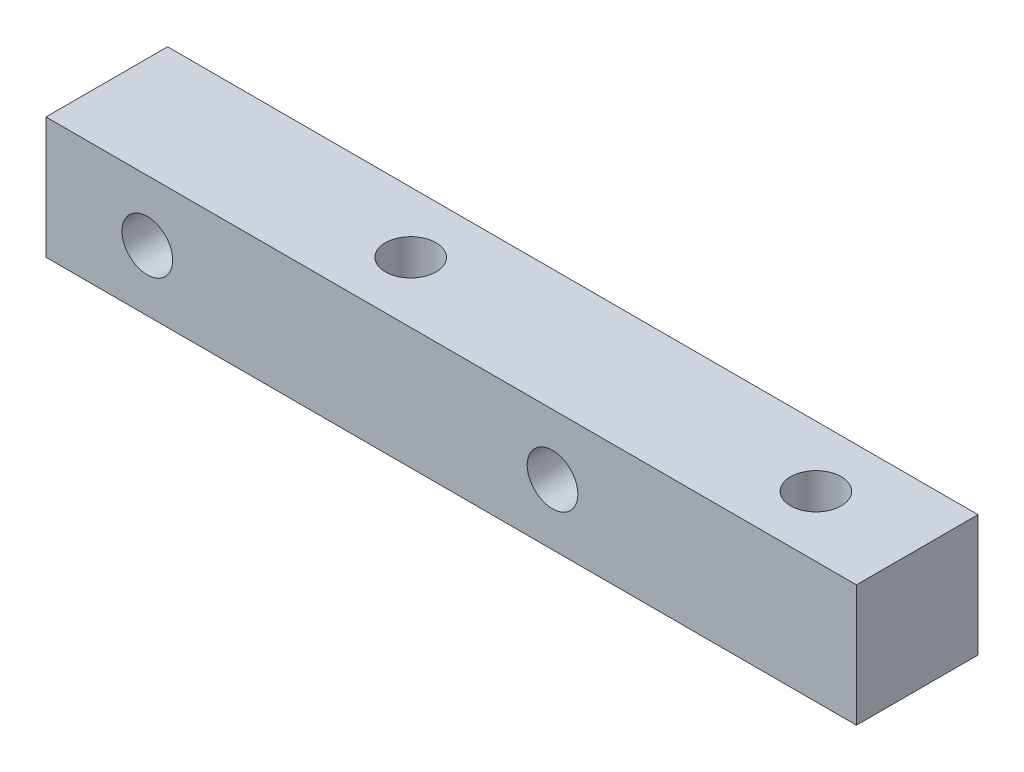
ISO-10303-21;
HEADER;
FILE_DESCRIPTION(('STEP AP214'),'2;1');
FILE_NAME('part.step','',(''),(''),'','','');
FILE_SCHEMA(('AUTOMOTIVE_DESIGN { 1 0 10303 214 1 1 1 1 }'));
ENDSEC;
DATA;
#1=APPLICATION_CONTEXT('core data for automotive mechanical design processes');
#2=APPLICATION_PROTOCOL_DEFINITION('international standard','automotive_design',2000,#1);
#3=PRODUCT_CONTEXT('',#1,'mechanical');
#4=PRODUCT('Part','Part','',(#3));
#5=PRODUCT_RELATED_PRODUCT_CATEGORY('part','',(#4));
#6=PRODUCT_DEFINITION_FORMATION('','',#4);
#7=PRODUCT_DEFINITION_CONTEXT('part definition',#1,'design');
#8=PRODUCT_DEFINITION('design','',#6,#7);
#9=PRODUCT_DEFINITION_SHAPE('','',#8);
#10=(LENGTH_UNIT() NAMED_UNIT(*) SI_UNIT(.MILLI.,.METRE.));
#11=(NAMED_UNIT(*) PLANE_ANGLE_UNIT() SI_UNIT($,.RADIAN.));
#12=(NAMED_UNIT(*) SI_UNIT($,.STERADIAN.) SOLID_ANGLE_UNIT());
#13=UNCERTAINTY_MEASURE_WITH_UNIT(LENGTH_MEASURE(1.E-05),#10,'distance_accuracy_value','');
#14=(GEOMETRIC_REPRESENTATION_CONTEXT(3) GLOBAL_UNCERTAINTY_ASSIGNED_CONTEXT((#13)) GLOBAL_UNIT_ASSIGNED_CONTEXT((#10,
#11,#12)) REPRESENTATION_CONTEXT('',''));
#15=CARTESIAN_POINT('',(0.,0.,0.));
#16=DIRECTION('',(0.,0.,1.));
#17=DIRECTION('',(1.,0.,0.));
#18=AXIS2_PLACEMENT_3D('',#15,#16,#17);
#19=CARTESIAN_POINT('',(20.,3.,-3.));
#20=DIRECTION('',(-1.,0.,0.));
#21=DIRECTION('',(0.,0.,1.));
#22=AXIS2_PLACEMENT_3D('',#19,#20,#21);
#23=PLANE('',#22);
#24=DIRECTION('',(0.,0.,-1.));
#25=VECTOR('',#24,1.);
#26=CARTESIAN_POINT('',(20.,-3.,-3.));
#27=LINE('',#26,#25);
#28=CARTESIAN_POINT('',(20.,-3.,3.));
#29=VERTEX_POINT('',#28);
#30=CARTESIAN_POINT('',(20.,-3.,-3.));
#31=VERTEX_POINT('',#30);
#32=EDGE_CURVE('E104',#29,#31,#27,.T.);
#33=ORIENTED_EDGE('',*,*,#32,.T.);
#34=DIRECTION('',(0.,-1.,0.));
#35=VECTOR('',#34,1.);
#36=CARTESIAN_POINT('',(20.,3.,-3.));
#37=LINE('',#36,#35);
#38=CARTESIAN_POINT('',(20.,3.,-3.));
#39=VERTEX_POINT('',#38);
#40=EDGE_CURVE('E11',#39,#31,#37,.T.);
#41=ORIENTED_EDGE('',*,*,#40,.F.);
#42=DIRECTION('',(0.,0.,-1.));
#43=VECTOR('',#42,1.);
#44=CARTESIAN_POINT('',(20.,3.,-3.));
#45=LINE('',#44,#43);
#46=CARTESIAN_POINT('',(20.,3.,3.));
#47=VERTEX_POINT('',#46);
#48=EDGE_CURVE('E92',#47,#39,#45,.T.);
#49=ORIENTED_EDGE('',*,*,#48,.F.);
#50=DIRECTION('',(0.,-1.,0.));
#51=VECTOR('',#50,1.);
#52=CARTESIAN_POINT('',(20.,3.,3.));
#53=LINE('',#52,#51);
#54=EDGE_CURVE('E100',#47,#29,#53,.T.);
#55=ORIENTED_EDGE('',*,*,#54,.T.);
#56=EDGE_LOOP('',(#33,#41,#49,#55));
#57=FACE_BOUND('',#56,.T.);
#58=ADVANCED_FACE('F41',(#57),#23,.F.);
#59=CARTESIAN_POINT('',(-20.,3.,-3.));
#60=DIRECTION('',(0.,0.,1.));
#61=DIRECTION('',(1.,0.,0.));
#62=AXIS2_PLACEMENT_3D('',#59,#60,#61);
#63=PLANE('',#62);
#64=CARTESIAN_POINT('',(-15.,0.,-3.));
#65=DIRECTION('',(0.,0.,1.));
#66=DIRECTION('',(1.,0.,0.));
#67=AXIS2_PLACEMENT_3D('',#64,#65,#66);
#68=CIRCLE('',#67,1.25);
#69=CARTESIAN_POINT('',(-13.75,0.,-3.));
#70=VERTEX_POINT('',#69);
#71=EDGE_CURVE('E135',#70,#70,#68,.T.);
#72=ORIENTED_EDGE('',*,*,#71,.T.);
#73=EDGE_LOOP('',(#72));
#74=FACE_BOUND('',#73,.T.);
#75=CARTESIAN_POINT('',(5.,0.,-3.));
#76=DIRECTION('',(0.,0.,1.));
#77=DIRECTION('',(1.,0.,0.));
#78=AXIS2_PLACEMENT_3D('',#75,#76,#77);
#79=CIRCLE('',#78,1.25);
#80=CARTESIAN_POINT('',(6.25,0.,-3.));
#81=VERTEX_POINT('',#80);
#82=EDGE_CURVE('E129',#81,#81,#79,.T.);
#83=ORIENTED_EDGE('',*,*,#82,.T.);
#84=EDGE_LOOP('',(#83));
#85=FACE_BOUND('',#84,.T.);
#86=DIRECTION('',(-1.,0.,0.));
#87=VECTOR('',#86,1.);
#88=CARTESIAN_POINT('',(-20.,-3.,-3.));
#89=LINE('',#88,#87);
#90=CARTESIAN_POINT('',(-20.,-3.,-3.));
#91=VERTEX_POINT('',#90);
#92=EDGE_CURVE('E96',#31,#91,#89,.T.);
#93=ORIENTED_EDGE('',*,*,#92,.T.);
#94=DIRECTION('',(0.,-1.,0.));
#95=VECTOR('',#94,1.);
#96=CARTESIAN_POINT('',(-20.,3.,-3.));
#97=LINE('',#96,#95);
#98=CARTESIAN_POINT('',(-20.,3.,-3.));
#99=VERTEX_POINT('',#98);
#100=EDGE_CURVE('E49',#99,#91,#97,.T.);
#101=ORIENTED_EDGE('',*,*,#100,.F.);
#102=DIRECTION('',(-1.,0.,0.));
#103=VECTOR('',#102,1.);
#104=CARTESIAN_POINT('',(-20.,3.,-3.));
#105=LINE('',#104,#103);
#106=EDGE_CURVE('E87',#39,#99,#105,.T.);
#107=ORIENTED_EDGE('',*,*,#106,.F.);
#108=ORIENTED_EDGE('',*,*,#40,.T.);
#109=EDGE_LOOP('',(#93,#101,#107,#108));
#110=FACE_BOUND('',#109,.T.);
#111=ADVANCED_FACE('F95',(#74,#85,#110),#63,.F.);
#112=CARTESIAN_POINT('',(-20.,3.,-3.));
#113=DIRECTION('',(1.,0.,0.));
#114=DIRECTION('',(0.,0.,-1.));
#115=AXIS2_PLACEMENT_3D('',#112,#113,#114);
#116=PLANE('',#115);
#117=DIRECTION('',(0.,0.,1.));
#118=VECTOR('',#117,1.);
#119=CARTESIAN_POINT('',(-20.,-3.,-3.));
#120=LINE('',#119,#118);
#121=CARTESIAN_POINT('',(-20.,-3.,3.));
#122=VERTEX_POINT('',#121);
#123=EDGE_CURVE('E74',#91,#122,#120,.T.);
#124=ORIENTED_EDGE('',*,*,#123,.T.);
#125=DIRECTION('',(0.,-1.,0.));
#126=VECTOR('',#125,1.);
#127=CARTESIAN_POINT('',(-20.,3.,3.));
#128=LINE('',#127,#126);
#129=CARTESIAN_POINT('',(-20.,3.,3.));
#130=VERTEX_POINT('',#129);
#131=EDGE_CURVE('E97',#130,#122,#128,.T.);
#132=ORIENTED_EDGE('',*,*,#131,.F.);
#133=DIRECTION('',(0.,0.,1.));
#134=VECTOR('',#133,1.);
#135=CARTESIAN_POINT('',(-20.,3.,-3.));
#136=LINE('',#135,#134);
#137=EDGE_CURVE('E90',#99,#130,#136,.T.);
#138=ORIENTED_EDGE('',*,*,#137,.F.);
#139=ORIENTED_EDGE('',*,*,#100,.T.);
#140=EDGE_LOOP('',(#124,#132,#138,#139));
#141=FACE_BOUND('',#140,.T.);
#142=ADVANCED_FACE('F98',(#141),#116,.F.);
#143=CARTESIAN_POINT('',(-20.,3.,3.));
#144=DIRECTION('',(0.,0.,-1.));
#145=DIRECTION('',(-1.,0.,0.));
#146=AXIS2_PLACEMENT_3D('',#143,#144,#145);
#147=PLANE('',#146);
#148=CARTESIAN_POINT('',(-15.,0.,3.));
#149=DIRECTION('',(0.,0.,1.));
#150=DIRECTION('',(1.,0.,0.));
#151=AXIS2_PLACEMENT_3D('',#148,#149,#150);
#152=CIRCLE('',#151,1.24999999999999);
#153=CARTESIAN_POINT('',(-13.75,0.,3.));
#154=VERTEX_POINT('',#153);
#155=EDGE_CURVE('E138',#154,#154,#152,.T.);
#156=ORIENTED_EDGE('',*,*,#155,.F.);
#157=EDGE_LOOP('',(#156));
#158=FACE_BOUND('',#157,.T.);
#159=CARTESIAN_POINT('',(5.,0.,3.));
#160=DIRECTION('',(0.,0.,1.));
#161=DIRECTION('',(1.,0.,0.));
#162=AXIS2_PLACEMENT_3D('',#159,#160,#161);
#163=CIRCLE('',#162,1.24999999999999);
#164=CARTESIAN_POINT('',(6.24999999999998,0.,3.));
#165=VERTEX_POINT('',#164);
#166=EDGE_CURVE('E132',#165,#165,#163,.T.);
#167=ORIENTED_EDGE('',*,*,#166,.F.);
#168=EDGE_LOOP('',(#167));
#169=FACE_BOUND('',#168,.T.);
#170=DIRECTION('',(1.,0.,0.));
#171=VECTOR('',#170,1.);
#172=CARTESIAN_POINT('',(-20.,-3.,3.));
#173=LINE('',#172,#171);
#174=EDGE_CURVE('E80',#122,#29,#173,.T.);
#175=ORIENTED_EDGE('',*,*,#174,.T.);
#176=ORIENTED_EDGE('',*,*,#54,.F.);
#177=DIRECTION('',(1.,0.,0.));
#178=VECTOR('',#177,1.);
#179=CARTESIAN_POINT('',(-20.,3.,3.));
#180=LINE('',#179,#178);
#181=EDGE_CURVE('E57',#130,#47,#180,.T.);
#182=ORIENTED_EDGE('',*,*,#181,.F.);
#183=ORIENTED_EDGE('',*,*,#131,.T.);
#184=EDGE_LOOP('',(#175,#176,#182,#183));
#185=FACE_BOUND('',#184,.T.);
#186=ADVANCED_FACE('F112',(#158,#169,#185),#147,.F.);
#187=CARTESIAN_POINT('',(0.,3.,0.));
#188=DIRECTION('',(0.,1.,0.));
#189=DIRECTION('',(0.,0.,1.));
#190=AXIS2_PLACEMENT_3D('',#187,#188,#189);
#191=PLANE('',#190);
#192=CARTESIAN_POINT('',(15.,3.,0.));
#193=DIRECTION('',(0.,1.,0.));
#194=DIRECTION('',(0.,0.,1.));
#195=AXIS2_PLACEMENT_3D('',#192,#193,#194);
#196=CIRCLE('',#195,1.24999999999999);
#197=CARTESIAN_POINT('',(15.,3.,1.24999999999999));
#198=VERTEX_POINT('',#197);
#199=EDGE_CURVE('E126',#198,#198,#196,.T.);
#200=ORIENTED_EDGE('',*,*,#199,.F.);
#201=EDGE_LOOP('',(#200));
#202=FACE_BOUND('',#201,.T.);
#203=CARTESIAN_POINT('',(-5.,3.,0.));
#204=DIRECTION('',(0.,1.,0.));
#205=DIRECTION('',(0.,0.,1.));
#206=AXIS2_PLACEMENT_3D('',#203,#204,#205);
#207=CIRCLE('',#206,1.24999999999999);
#208=CARTESIAN_POINT('',(-5.,3.,1.24999999999999));
#209=VERTEX_POINT('',#208);
#210=EDGE_CURVE('E120',#209,#209,#207,.T.);
#211=ORIENTED_EDGE('',*,*,#210,.F.);
#212=EDGE_LOOP('',(#211));
#213=FACE_BOUND('',#212,.T.);
#214=ORIENTED_EDGE('',*,*,#48,.T.);
#215=ORIENTED_EDGE('',*,*,#106,.T.);
#216=ORIENTED_EDGE('',*,*,#137,.T.);
#217=ORIENTED_EDGE('',*,*,#181,.T.);
#218=EDGE_LOOP('',(#214,#215,#216,#217));
#219=FACE_BOUND('',#218,.T.);
#220=ADVANCED_FACE('F88',(#202,#213,#219),#191,.T.);
#221=CARTESIAN_POINT('',(0.,-3.,0.));
#222=DIRECTION('',(0.,1.,0.));
#223=DIRECTION('',(0.,0.,1.));
#224=AXIS2_PLACEMENT_3D('',#221,#222,#223);
#225=PLANE('',#224);
#226=CARTESIAN_POINT('',(15.,-3.,0.));
#227=DIRECTION('',(0.,1.,0.));
#228=DIRECTION('',(0.,0.,1.));
#229=AXIS2_PLACEMENT_3D('',#226,#227,#228);
#230=CIRCLE('',#229,1.25);
#231=CARTESIAN_POINT('',(15.,-3.,1.25));
#232=VERTEX_POINT('',#231);
#233=EDGE_CURVE('E123',#232,#232,#230,.T.);
#234=ORIENTED_EDGE('',*,*,#233,.T.);
#235=EDGE_LOOP('',(#234));
#236=FACE_BOUND('',#235,.T.);
#237=CARTESIAN_POINT('',(-5.,-3.,0.));
#238=DIRECTION('',(0.,1.,0.));
#239=DIRECTION('',(0.,0.,1.));
#240=AXIS2_PLACEMENT_3D('',#237,#238,#239);
#241=CIRCLE('',#240,1.25);
#242=CARTESIAN_POINT('',(-5.,-3.,1.25));
#243=VERTEX_POINT('',#242);
#244=EDGE_CURVE('E107',#243,#243,#241,.T.);
#245=ORIENTED_EDGE('',*,*,#244,.T.);
#246=EDGE_LOOP('',(#245));
#247=FACE_BOUND('',#246,.T.);
#248=ORIENTED_EDGE('',*,*,#32,.F.);
#249=ORIENTED_EDGE('',*,*,#174,.F.);
#250=ORIENTED_EDGE('',*,*,#123,.F.);
#251=ORIENTED_EDGE('',*,*,#92,.F.);
#252=EDGE_LOOP('',(#248,#249,#250,#251));
#253=FACE_BOUND('',#252,.T.);
#254=ADVANCED_FACE('F115',(#236,#247,#253),#225,.F.);
#255=CARTESIAN_POINT('',(-5.,3.,0.));
#256=DIRECTION('',(0.,1.,0.));
#257=DIRECTION('',(0.,0.,1.));
#258=AXIS2_PLACEMENT_3D('',#255,#256,#257);
#259=CYLINDRICAL_SURFACE('',#258,1.24999999999999);
#260=ORIENTED_EDGE('',*,*,#244,.F.);
#261=EDGE_LOOP('',(#260));
#262=FACE_BOUND('',#261,.T.);
#263=ORIENTED_EDGE('',*,*,#210,.T.);
#264=EDGE_LOOP('',(#263));
#265=FACE_BOUND('',#264,.T.);
#266=ADVANCED_FACE('F160',(#262,#265),#259,.F.);
#267=CARTESIAN_POINT('',(15.,3.,0.));
#268=DIRECTION('',(0.,1.,0.));
#269=DIRECTION('',(0.,0.,1.));
#270=AXIS2_PLACEMENT_3D('',#267,#268,#269);
#271=CYLINDRICAL_SURFACE('',#270,1.24999999999999);
#272=ORIENTED_EDGE('',*,*,#233,.F.);
#273=EDGE_LOOP('',(#272));
#274=FACE_BOUND('',#273,.T.);
#275=ORIENTED_EDGE('',*,*,#199,.T.);
#276=EDGE_LOOP('',(#275));
#277=FACE_BOUND('',#276,.T.);
#278=ADVANCED_FACE('F151',(#274,#277),#271,.F.);
#279=CARTESIAN_POINT('',(5.,0.,3.));
#280=DIRECTION('',(0.,0.,1.));
#281=DIRECTION('',(1.,0.,0.));
#282=AXIS2_PLACEMENT_3D('',#279,#280,#281);
#283=CYLINDRICAL_SURFACE('',#282,1.24999999999999);
#284=ORIENTED_EDGE('',*,*,#82,.F.);
#285=EDGE_LOOP('',(#284));
#286=FACE_BOUND('',#285,.T.);
#287=ORIENTED_EDGE('',*,*,#166,.T.);
#288=EDGE_LOOP('',(#287));
#289=FACE_BOUND('',#288,.T.);
#290=ADVANCED_FACE('F149',(#286,#289),#283,.F.);
#291=CARTESIAN_POINT('',(-15.,0.,3.));
#292=DIRECTION('',(0.,0.,1.));
#293=DIRECTION('',(1.,0.,0.));
#294=AXIS2_PLACEMENT_3D('',#291,#292,#293);
#295=CYLINDRICAL_SURFACE('',#294,1.24999999999999);
#296=ORIENTED_EDGE('',*,*,#71,.F.);
#297=EDGE_LOOP('',(#296));
#298=FACE_BOUND('',#297,.T.);
#299=ORIENTED_EDGE('',*,*,#155,.T.);
#300=EDGE_LOOP('',(#299));
#301=FACE_BOUND('',#300,.T.);
#302=ADVANCED_FACE('F142',(#298,#301),#295,.F.);
#303=CLOSED_SHELL('',(#58,#111,#142,#186,#220,#254,#266,#278,#290,#302));
#304=MANIFOLD_SOLID_BREP('B2',#303);
#305=ADVANCED_BREP_SHAPE_REPRESENTATION('',(#18,#304),#14);
#306=SHAPE_DEFINITION_REPRESENTATION(#9,#305);
ENDSEC;
END-ISO-10303-21;
